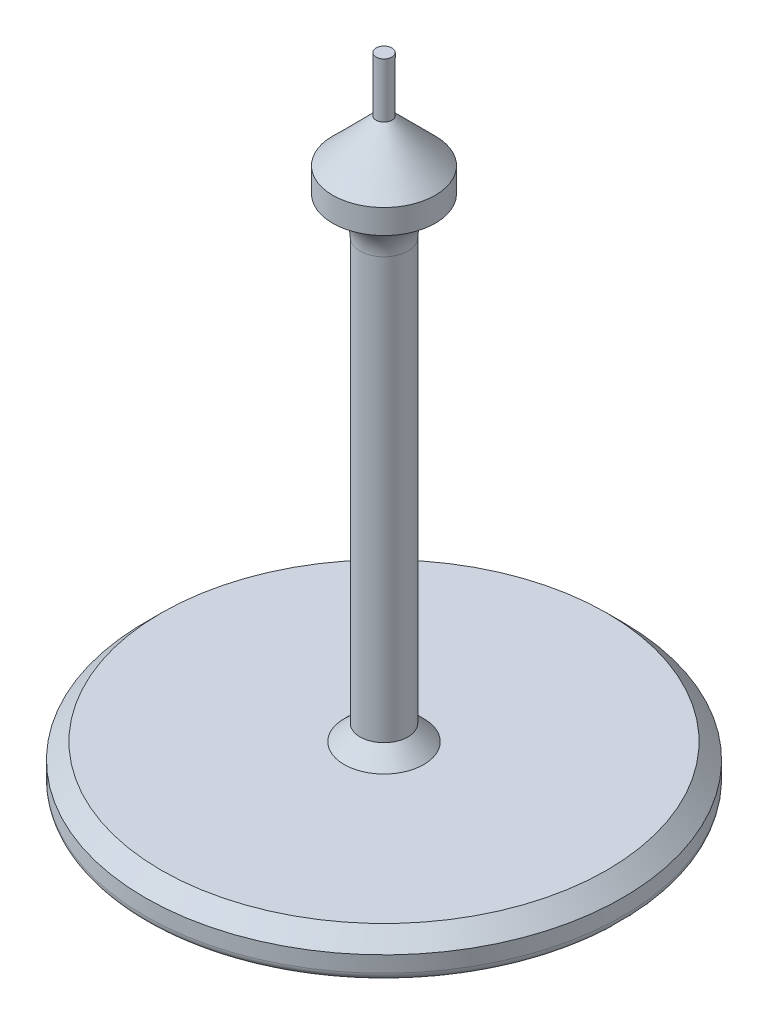
ISO-10303-21;
HEADER;
FILE_DESCRIPTION(('STEP AP214'),'2;1');
FILE_NAME('part.step','',(''),(''),'','','');
FILE_SCHEMA(('AUTOMOTIVE_DESIGN { 1 0 10303 214 1 1 1 1 }'));
ENDSEC;
DATA;
#1=APPLICATION_CONTEXT('core data for automotive mechanical design processes');
#2=APPLICATION_PROTOCOL_DEFINITION('international standard','automotive_design',2000,#1);
#3=PRODUCT_CONTEXT('',#1,'mechanical');
#4=PRODUCT('Part','Part','',(#3));
#5=PRODUCT_RELATED_PRODUCT_CATEGORY('part','',(#4));
#6=PRODUCT_DEFINITION_FORMATION('','',#4);
#7=PRODUCT_DEFINITION_CONTEXT('part definition',#1,'design');
#8=PRODUCT_DEFINITION('design','',#6,#7);
#9=PRODUCT_DEFINITION_SHAPE('','',#8);
#10=(LENGTH_UNIT() NAMED_UNIT(*) SI_UNIT(.MILLI.,.METRE.));
#11=(NAMED_UNIT(*) PLANE_ANGLE_UNIT() SI_UNIT($,.RADIAN.));
#12=(NAMED_UNIT(*) SI_UNIT($,.STERADIAN.) SOLID_ANGLE_UNIT());
#13=UNCERTAINTY_MEASURE_WITH_UNIT(LENGTH_MEASURE(1.E-05),#10,'distance_accuracy_value','');
#14=(GEOMETRIC_REPRESENTATION_CONTEXT(3) GLOBAL_UNCERTAINTY_ASSIGNED_CONTEXT((#13)) GLOBAL_UNIT_ASSIGNED_CONTEXT((#10,
#11,#12)) REPRESENTATION_CONTEXT('',''));
#15=CARTESIAN_POINT('',(0.,0.,0.));
#16=DIRECTION('',(0.,0.,1.));
#17=DIRECTION('',(1.,0.,0.));
#18=AXIS2_PLACEMENT_3D('',#15,#16,#17);
#19=CARTESIAN_POINT('',(0.,79.3548387096774,0.));
#20=DIRECTION('',(0.,1.,0.));
#21=DIRECTION('',(0.,0.,1.));
#22=AXIS2_PLACEMENT_3D('',#19,#20,#21);
#23=CYLINDRICAL_SURFACE('',#22,2.99999999999999);
#24=CARTESIAN_POINT('',(0.,6.77545310368437,0.));
#25=DIRECTION('',(0.,1.,0.));
#26=DIRECTION('',(0.,0.,1.));
#27=AXIS2_PLACEMENT_3D('',#24,#25,#26);
#28=CIRCLE('',#27,2.99999999999999);
#29=CARTESIAN_POINT('',(0.,6.77545310368437,2.99999999999999));
#30=VERTEX_POINT('',#29);
#31=EDGE_CURVE('E55',#30,#30,#28,.F.);
#32=ORIENTED_EDGE('',*,*,#31,.T.);
#33=EDGE_LOOP('',(#32));
#34=FACE_BOUND('',#33,.T.);
#35=CARTESIAN_POINT('',(0.,-46.1048387096774,0.));
#36=DIRECTION('',(0.,1.,0.));
#37=DIRECTION('',(0.,0.,1.));
#38=AXIS2_PLACEMENT_3D('',#35,#36,#37);
#39=CIRCLE('',#38,2.99999999999999);
#40=CARTESIAN_POINT('',(0.,-46.1048387096774,2.99999999999999));
#41=VERTEX_POINT('',#40);
#42=EDGE_CURVE('E66',#41,#41,#39,.T.);
#43=ORIENTED_EDGE('',*,*,#42,.T.);
#44=EDGE_LOOP('',(#43));
#45=FACE_BOUND('',#44,.T.);
#46=ADVANCED_FACE('F35',(#34,#45),#23,.T.);
#47=CARTESIAN_POINT('',(0.,79.3548387096774,0.));
#48=DIRECTION('',(0.,1.,0.));
#49=DIRECTION('',(0.,0.,1.));
#50=AXIS2_PLACEMENT_3D('',#47,#48,#49);
#51=CYLINDRICAL_SURFACE('',#50,30.);
#52=CARTESIAN_POINT('',(0.,-52.1048387096774,0.));
#53=DIRECTION('',(0.,-1.,0.));
#54=DIRECTION('',(0.,0.,-1.));
#55=AXIS2_PLACEMENT_3D('',#52,#53,#54);
#56=CIRCLE('',#55,30.);
#57=CARTESIAN_POINT('',(0.,-52.1048387096774,-30.));
#58=VERTEX_POINT('',#57);
#59=EDGE_CURVE('E42',#58,#58,#56,.F.);
#60=ORIENTED_EDGE('',*,*,#59,.T.);
#61=EDGE_LOOP('',(#60));
#62=FACE_BOUND('',#61,.T.);
#63=CARTESIAN_POINT('',(0.,-50.1048387096775,0.));
#64=DIRECTION('',(0.,1.,0.));
#65=DIRECTION('',(0.,0.,1.));
#66=AXIS2_PLACEMENT_3D('',#63,#64,#65);
#67=CIRCLE('',#66,30.);
#68=CARTESIAN_POINT('',(0.,-50.1048387096775,30.));
#69=VERTEX_POINT('',#68);
#70=EDGE_CURVE('E46',#69,#69,#67,.F.);
#71=ORIENTED_EDGE('',*,*,#70,.T.);
#72=EDGE_LOOP('',(#71));
#73=FACE_BOUND('',#72,.T.);
#74=ADVANCED_FACE('F97',(#62,#73),#51,.T.);
#75=CARTESIAN_POINT('',(-30.,-48.1048387096774,0.));
#76=DIRECTION('',(0.,1.,0.));
#77=DIRECTION('',(0.,0.,1.));
#78=AXIS2_PLACEMENT_3D('',#75,#76,#77);
#79=PLANE('',#78);
#80=CARTESIAN_POINT('',(0.,-48.1048387096774,0.));
#81=DIRECTION('',(0.,1.,0.));
#82=DIRECTION('',(0.,0.,1.));
#83=AXIS2_PLACEMENT_3D('',#80,#81,#82);
#84=CIRCLE('',#83,28.);
#85=CARTESIAN_POINT('',(0.,-48.1048387096774,28.));
#86=VERTEX_POINT('',#85);
#87=EDGE_CURVE('E50',#86,#86,#84,.T.);
#88=ORIENTED_EDGE('',*,*,#87,.T.);
#89=EDGE_LOOP('',(#88));
#90=FACE_BOUND('',#89,.T.);
#91=CARTESIAN_POINT('',(0.,-48.1048387096774,0.));
#92=DIRECTION('',(0.,1.,0.));
#93=DIRECTION('',(0.,0.,1.));
#94=AXIS2_PLACEMENT_3D('',#91,#92,#93);
#95=CIRCLE('',#94,4.99999999999998);
#96=CARTESIAN_POINT('',(0.,-48.1048387096774,4.99999999999998));
#97=VERTEX_POINT('',#96);
#98=EDGE_CURVE('E58',#97,#97,#95,.T.);
#99=ORIENTED_EDGE('',*,*,#98,.F.);
#100=EDGE_LOOP('',(#99));
#101=FACE_BOUND('',#100,.T.);
#102=ADVANCED_FACE('F105',(#90,#101),#79,.T.);
#103=CARTESIAN_POINT('',(0.,-46.1048387096774,0.));
#104=DIRECTION('',(0.,-1.,0.));
#105=DIRECTION('',(0.,0.,-1.));
#106=AXIS2_PLACEMENT_3D('',#103,#104,#105);
#107=CONICAL_SURFACE('',#106,2.99999999999999,0.785398163397447);
#108=ORIENTED_EDGE('',*,*,#98,.T.);
#109=EDGE_LOOP('',(#108));
#110=FACE_BOUND('',#109,.T.);
#111=ORIENTED_EDGE('',*,*,#42,.F.);
#112=EDGE_LOOP('',(#111));
#113=FACE_BOUND('',#112,.T.);
#114=ADVANCED_FACE('F111',(#110,#113),#107,.T.);
#115=CARTESIAN_POINT('',(-30.,-53.1048387096774,0.));
#116=DIRECTION('',(0.,-1.,0.));
#117=DIRECTION('',(0.,0.,-1.));
#118=AXIS2_PLACEMENT_3D('',#115,#116,#117);
#119=PLANE('',#118);
#120=CARTESIAN_POINT('',(0.,-53.1048387096774,0.));
#121=DIRECTION('',(0.,-1.,0.));
#122=DIRECTION('',(0.,0.,-1.));
#123=AXIS2_PLACEMENT_3D('',#120,#121,#122);
#124=CIRCLE('',#123,29.);
#125=CARTESIAN_POINT('',(0.,-53.1048387096774,-29.));
#126=VERTEX_POINT('',#125);
#127=EDGE_CURVE('E10',#126,#126,#124,.T.);
#128=ORIENTED_EDGE('',*,*,#127,.T.);
#129=EDGE_LOOP('',(#128));
#130=FACE_BOUND('',#129,.T.);
#131=ADVANCED_FACE('F114',(#130),#119,.T.);
#132=CARTESIAN_POINT('',(0.,11.5291358865381,0.));
#133=DIRECTION('',(0.,1.,0.));
#134=DIRECTION('',(0.,0.,1.));
#135=AXIS2_PLACEMENT_3D('',#132,#133,#134);
#136=CYLINDRICAL_SURFACE('',#135,6.45);
#137=CARTESIAN_POINT('',(0.,14.5791358865381,0.));
#138=DIRECTION('',(0.,-1.,0.));
#139=DIRECTION('',(0.,0.,-1.));
#140=AXIS2_PLACEMENT_3D('',#137,#138,#139);
#141=CIRCLE('',#140,6.45);
#142=CARTESIAN_POINT('',(0.,14.5791358865381,-6.45));
#143=VERTEX_POINT('',#142);
#144=EDGE_CURVE('E59',#143,#143,#141,.F.);
#145=ORIENTED_EDGE('',*,*,#144,.F.);
#146=EDGE_LOOP('',(#145));
#147=FACE_BOUND('',#146,.T.);
#148=CARTESIAN_POINT('',(0.,11.5291358865381,0.));
#149=DIRECTION('',(0.,1.,0.));
#150=DIRECTION('',(0.,0.,1.));
#151=AXIS2_PLACEMENT_3D('',#148,#149,#150);
#152=CIRCLE('',#151,6.45);
#153=CARTESIAN_POINT('',(0.,11.5291358865381,6.45));
#154=VERTEX_POINT('',#153);
#155=EDGE_CURVE('E62',#154,#154,#152,.T.);
#156=ORIENTED_EDGE('',*,*,#155,.T.);
#157=EDGE_LOOP('',(#156));
#158=FACE_BOUND('',#157,.T.);
#159=ADVANCED_FACE('F93',(#147,#158),#136,.T.);
#160=CARTESIAN_POINT('',(0.,14.5291358865381,0.));
#161=DIRECTION('',(0.,-1.,0.));
#162=DIRECTION('',(0.,0.,-1.));
#163=AXIS2_PLACEMENT_3D('',#160,#161,#162);
#164=CONICAL_SURFACE('',#163,6.5,0.78539816339745);
#165=CARTESIAN_POINT('',(0.,20.0291358865381,0.));
#166=DIRECTION('',(0.,1.,0.));
#167=DIRECTION('',(0.,0.,1.));
#168=AXIS2_PLACEMENT_3D('',#165,#166,#167);
#169=CIRCLE('',#168,0.999999999999996);
#170=CARTESIAN_POINT('',(0.,20.0291358865381,-0.999999999999997));
#171=VERTEX_POINT('',#170);
#172=EDGE_CURVE('E63',#171,#171,#169,.T.);
#173=CARTESIAN_POINT('',(0.,14.5791358865381,-6.45));
#174=CARTESIAN_POINT('',(0.,14.6359067198714,-6.39322916666667));
#175=CARTESIAN_POINT('',(0.,14.6926775532048,-6.33645833333333));
#176=CARTESIAN_POINT('',(0.,14.8062192198714,-6.22291666666667));
#177=CARTESIAN_POINT('',(0.,14.8629900532048,-6.16614583333333));
#178=CARTESIAN_POINT('',(0.,14.9765317198714,-6.05260416666667));
#179=CARTESIAN_POINT('',(0.,15.0333025532048,-5.99583333333333));
#180=CARTESIAN_POINT('',(0.,15.1468442198714,-5.88229166666667));
#181=CARTESIAN_POINT('',(0.,15.2036150532048,-5.82552083333333));
#182=CARTESIAN_POINT('',(0.,15.3171567198714,-5.71197916666667));
#183=CARTESIAN_POINT('',(0.,15.3739275532048,-5.65520833333333));
#184=CARTESIAN_POINT('',(0.,15.4874692198714,-5.54166666666667));
#185=CARTESIAN_POINT('',(0.,15.5442400532048,-5.48489583333333));
#186=CARTESIAN_POINT('',(0.,15.6577817198714,-5.37135416666667));
#187=CARTESIAN_POINT('',(0.,15.7145525532048,-5.31458333333333));
#188=CARTESIAN_POINT('',(0.,15.8280942198714,-5.20104166666667));
#189=CARTESIAN_POINT('',(0.,15.8848650532048,-5.14427083333333));
#190=CARTESIAN_POINT('',(0.,15.9984067198714,-5.03072916666667));
#191=CARTESIAN_POINT('',(0.,16.0551775532048,-4.97395833333333));
#192=CARTESIAN_POINT('',(0.,16.1687192198714,-4.86041666666667));
#193=CARTESIAN_POINT('',(0.,16.2254900532048,-4.80364583333333));
#194=CARTESIAN_POINT('',(0.,16.3390317198714,-4.69010416666667));
#195=CARTESIAN_POINT('',(0.,16.3958025532048,-4.63333333333333));
#196=CARTESIAN_POINT('',(0.,16.5093442198714,-4.51979166666666));
#197=CARTESIAN_POINT('',(0.,16.5661150532048,-4.46302083333333));
#198=CARTESIAN_POINT('',(0.,16.6796567198714,-4.34947916666667));
#199=CARTESIAN_POINT('',(0.,16.7364275532048,-4.29270833333333));
#200=CARTESIAN_POINT('',(0.,16.8499692198714,-4.17916666666667));
#201=CARTESIAN_POINT('',(0.,16.9067400532048,-4.12239583333333));
#202=CARTESIAN_POINT('',(0.,17.0202817198714,-4.00885416666667));
#203=CARTESIAN_POINT('',(0.,17.0770525532048,-3.95208333333333));
#204=CARTESIAN_POINT('',(0.,17.1905942198714,-3.83854166666667));
#205=CARTESIAN_POINT('',(0.,17.2473650532048,-3.78177083333333));
#206=CARTESIAN_POINT('',(0.,17.3609067198714,-3.66822916666667));
#207=CARTESIAN_POINT('',(0.,17.4176775532048,-3.61145833333333));
#208=CARTESIAN_POINT('',(0.,17.5312192198714,-3.49791666666667));
#209=CARTESIAN_POINT('',(0.,17.5879900532048,-3.44114583333333));
#210=CARTESIAN_POINT('',(0.,17.7015317198714,-3.32760416666666));
#211=CARTESIAN_POINT('',(0.,17.7583025532048,-3.27083333333333));
#212=CARTESIAN_POINT('',(0.,17.8718442198714,-3.15729166666667));
#213=CARTESIAN_POINT('',(0.,17.9286150532048,-3.10052083333333));
#214=CARTESIAN_POINT('',(0.,18.0421567198714,-2.98697916666666));
#215=CARTESIAN_POINT('',(0.,18.0989275532048,-2.93020833333333));
#216=CARTESIAN_POINT('',(0.,18.2124692198714,-2.81666666666666));
#217=CARTESIAN_POINT('',(0.,18.2692400532048,-2.75989583333333));
#218=CARTESIAN_POINT('',(0.,18.3827817198714,-2.64635416666667));
#219=CARTESIAN_POINT('',(0.,18.4395525532048,-2.58958333333333));
#220=CARTESIAN_POINT('',(0.,18.5530942198714,-2.47604166666666));
#221=CARTESIAN_POINT('',(0.,18.6098650532048,-2.41927083333333));
#222=CARTESIAN_POINT('',(0.,18.7234067198714,-2.30572916666666));
#223=CARTESIAN_POINT('',(0.,18.7801775532048,-2.24895833333333));
#224=CARTESIAN_POINT('',(0.,18.8937192198714,-2.13541666666666));
#225=CARTESIAN_POINT('',(0.,18.9504900532048,-2.07864583333333));
#226=CARTESIAN_POINT('',(0.,19.0640317198714,-1.96510416666666));
#227=CARTESIAN_POINT('',(0.,19.1208025532048,-1.90833333333333));
#228=CARTESIAN_POINT('',(0.,19.2343442198714,-1.79479166666666));
#229=CARTESIAN_POINT('',(0.,19.2911150532048,-1.73802083333333));
#230=CARTESIAN_POINT('',(0.,19.4046567198714,-1.62447916666666));
#231=CARTESIAN_POINT('',(0.,19.4614275532048,-1.56770833333333));
#232=CARTESIAN_POINT('',(0.,19.5749692198714,-1.45416666666666));
#233=CARTESIAN_POINT('',(0.,19.6317400532048,-1.39739583333333));
#234=CARTESIAN_POINT('',(0.,19.7452817198714,-1.28385416666666));
#235=CARTESIAN_POINT('',(0.,19.8020525532048,-1.22708333333333));
#236=CARTESIAN_POINT('',(0.,19.9155942198714,-1.11354166666666));
#237=CARTESIAN_POINT('',(0.,19.9723650532048,-1.05677083333333));
#238=CARTESIAN_POINT('',(0.,20.0291358865381,-0.999999999999997));
#239=B_SPLINE_CURVE_WITH_KNOTS('',3,(#173,#174,#175,#176,#177,#178,#179,#180,#181,#182,#183,
#184,#185,#186,#187,#188,#189,#190,#191,#192,#193,#194,#195,#196,#197,#198,#199,#200,#201,#202,
#203,#204,#205,#206,#207,#208,#209,#210,#211,#212,#213,#214,#215,#216,#217,#218,#219,#220,#221,
#222,#223,#224,#225,#226,#227,#228,#229,#230,#231,#232,#233,#234,#235,#236,#237,#238),
.UNSPECIFIED.,.F.,.F.,(4,2,2,2,2,2,2,2,2,2,2,2,2,2,2,2,2,2,2,2,2,2,2,2,2,2,2,2,2,2,2,2,4),(0.,
0.240858247341668,0.481716494683336,0.722574742025003,0.963432989366671,1.20429123670834,
1.44514948405001,1.68600773139167,1.92686597873334,2.16772422607501,2.40858247341668,
2.64944072075834,2.89029896810001,3.13115721544168,3.37201546278335,3.61287371012501,
3.85373195746668,4.09459020480835,4.33544845215002,4.57630669949168,4.81716494683335,
5.05802319417502,5.29888144151669,5.53973968885835,5.78059793620002,6.02145618354169,
6.26231443088336,6.50317267822502,6.74403092556669,6.98488917290836,7.22574742025003,
7.46660566759169,7.70746391493336),.UNSPECIFIED.);
#240=EDGE_CURVE('BSEAM82',#143,#171,#239,.T.);
#241=ORIENTED_EDGE('',*,*,#144,.T.);
#242=ORIENTED_EDGE('',*,*,#172,.F.);
#243=ORIENTED_EDGE('',*,*,#240,.T.);
#244=ORIENTED_EDGE('',*,*,#240,.F.);
#245=EDGE_LOOP('',(#241,#243,#242,#244));
#246=FACE_BOUND('',#245,.T.);
#247=ADVANCED_FACE('F82',(#246),#164,.T.);
#248=CARTESIAN_POINT('',(0.,43.3274105726191,0.));
#249=DIRECTION('',(0.,1.,0.));
#250=DIRECTION('',(0.,0.,1.));
#251=AXIS2_PLACEMENT_3D('',#248,#249,#250);
#252=CYLINDRICAL_SURFACE('',#251,0.999999999999996);
#253=ORIENTED_EDGE('',*,*,#172,.T.);
#254=EDGE_LOOP('',(#253));
#255=FACE_BOUND('',#254,.T.);
#256=CARTESIAN_POINT('',(0.,26.8951612903226,0.));
#257=DIRECTION('',(0.,1.,0.));
#258=DIRECTION('',(0.,0.,1.));
#259=AXIS2_PLACEMENT_3D('',#256,#257,#258);
#260=CIRCLE('',#259,0.999999999999996);
#261=CARTESIAN_POINT('',(0.,26.8951612903226,0.999999999999996));
#262=VERTEX_POINT('',#261);
#263=EDGE_CURVE('E73',#262,#262,#260,.T.);
#264=ORIENTED_EDGE('',*,*,#263,.F.);
#265=EDGE_LOOP('',(#264));
#266=FACE_BOUND('',#265,.T.);
#267=ADVANCED_FACE('F79',(#255,#266),#252,.T.);
#268=CARTESIAN_POINT('',(0.,6.77545310368437,0.));
#269=DIRECTION('',(0.,1.,0.));
#270=DIRECTION('',(0.,0.,1.));
#271=AXIS2_PLACEMENT_3D('',#268,#269,#270);
#272=TOROIDAL_SURFACE('',#271,7.99999999999999,5.);
#273=ORIENTED_EDGE('',*,*,#155,.F.);
#274=EDGE_LOOP('',(#273));
#275=FACE_BOUND('',#274,.T.);
#276=ORIENTED_EDGE('',*,*,#31,.F.);
#277=EDGE_LOOP('',(#276));
#278=FACE_BOUND('',#277,.T.);
#279=ADVANCED_FACE('F81',(#275,#278),#272,.F.);
#280=CARTESIAN_POINT('',(0.,-48.1048387096774,0.));
#281=DIRECTION('',(0.,-1.,0.));
#282=DIRECTION('',(0.,0.,-1.));
#283=AXIS2_PLACEMENT_3D('',#280,#281,#282);
#284=CONICAL_SURFACE('',#283,28.,0.785398163397445);
#285=ORIENTED_EDGE('',*,*,#70,.F.);
#286=EDGE_LOOP('',(#285));
#287=FACE_BOUND('',#286,.T.);
#288=ORIENTED_EDGE('',*,*,#87,.F.);
#289=EDGE_LOOP('',(#288));
#290=FACE_BOUND('',#289,.T.);
#291=ADVANCED_FACE('F89',(#287,#290),#284,.T.);
#292=CARTESIAN_POINT('',(0.,-52.1048387096774,0.));
#293=DIRECTION('',(0.,-1.,0.));
#294=DIRECTION('',(0.,0.,-1.));
#295=AXIS2_PLACEMENT_3D('',#292,#293,#294);
#296=TOROIDAL_SURFACE('',#295,29.,1.);
#297=ORIENTED_EDGE('',*,*,#127,.F.);
#298=EDGE_LOOP('',(#297));
#299=FACE_BOUND('',#298,.T.);
#300=ORIENTED_EDGE('',*,*,#59,.F.);
#301=EDGE_LOOP('',(#300));
#302=FACE_BOUND('',#301,.T.);
#303=ADVANCED_FACE('F37',(#299,#302),#296,.T.);
#304=CARTESIAN_POINT('',(-2.99999999999998,26.8951612903226,0.));
#305=DIRECTION('',(0.,1.,0.));
#306=DIRECTION('',(0.,0.,1.));
#307=AXIS2_PLACEMENT_3D('',#304,#305,#306);
#308=PLANE('',#307);
#309=ORIENTED_EDGE('',*,*,#263,.T.);
#310=EDGE_LOOP('',(#309));
#311=FACE_BOUND('',#310,.T.);
#312=ADVANCED_FACE('F77',(#311),#308,.T.);
#313=CLOSED_SHELL('',(#46,#74,#102,#114,#131,#159,#247,#267,#279,#291,#303,#312));
#314=MANIFOLD_SOLID_BREP('B2',#313);
#315=ADVANCED_BREP_SHAPE_REPRESENTATION('',(#18,#314),#14);
#316=SHAPE_DEFINITION_REPRESENTATION(#9,#315);
ENDSEC;
END-ISO-10303-21;
